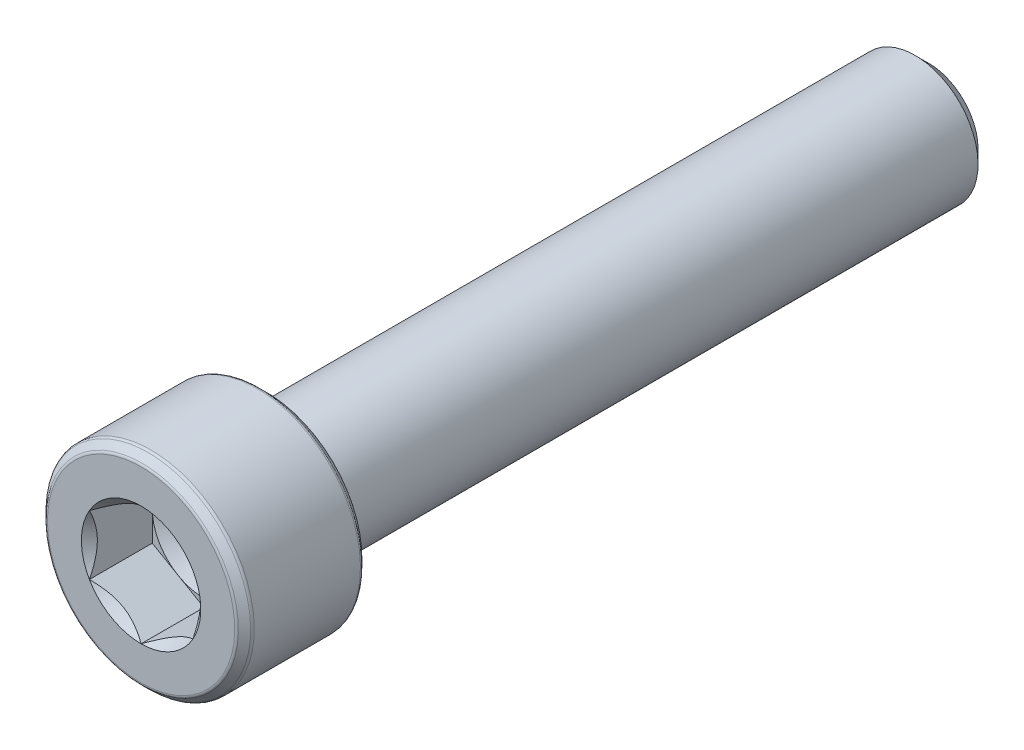
ISO-10303-21;
HEADER;
FILE_DESCRIPTION(('STEP AP214'),'2;1');
FILE_NAME('part.step','',(''),(''),'','','');
FILE_SCHEMA(('AUTOMOTIVE_DESIGN { 1 0 10303 214 1 1 1 1 }'));
ENDSEC;
DATA;
#1=APPLICATION_CONTEXT('core data for automotive mechanical design processes');
#2=APPLICATION_PROTOCOL_DEFINITION('international standard','automotive_design',2000,#1);
#3=PRODUCT_CONTEXT('',#1,'mechanical');
#4=PRODUCT('Part','Part','',(#3));
#5=PRODUCT_RELATED_PRODUCT_CATEGORY('part','',(#4));
#6=PRODUCT_DEFINITION_FORMATION('','',#4);
#7=PRODUCT_DEFINITION_CONTEXT('part definition',#1,'design');
#8=PRODUCT_DEFINITION('design','',#6,#7);
#9=PRODUCT_DEFINITION_SHAPE('','',#8);
#10=(LENGTH_UNIT() NAMED_UNIT(*) SI_UNIT(.MILLI.,.METRE.));
#11=(NAMED_UNIT(*) PLANE_ANGLE_UNIT() SI_UNIT($,.RADIAN.));
#12=(NAMED_UNIT(*) SI_UNIT($,.STERADIAN.) SOLID_ANGLE_UNIT());
#13=UNCERTAINTY_MEASURE_WITH_UNIT(LENGTH_MEASURE(1.E-05),#10,'distance_accuracy_value','');
#14=(GEOMETRIC_REPRESENTATION_CONTEXT(3) GLOBAL_UNCERTAINTY_ASSIGNED_CONTEXT((#13)) GLOBAL_UNIT_ASSIGNED_CONTEXT((#10,
#11,#12)) REPRESENTATION_CONTEXT('',''));
#15=CARTESIAN_POINT('',(0.,0.,0.));
#16=DIRECTION('',(0.,0.,1.));
#17=DIRECTION('',(1.,0.,0.));
#18=AXIS2_PLACEMENT_3D('',#15,#16,#17);
#19=CARTESIAN_POINT('',(0.,1.984375,12.7));
#20=DIRECTION('',(0.,0.,-1.));
#21=DIRECTION('',(0.,1.,0.));
#22=AXIS2_PLACEMENT_3D('',#19,#20,#21);
#23=PLANE('',#22);
#24=DIRECTION('',(-0.866025403784439,0.499999999999999,0.));
#25=VECTOR('',#24,1.);
#26=CARTESIAN_POINT('',(1.98437499999999,1.14567944042317,12.7));
#27=LINE('',#26,#25);
#28=CARTESIAN_POINT('',(1.98437499999999,1.14567944042317,12.7));
#29=VERTEX_POINT('',#28);
#30=CARTESIAN_POINT('',(0.992187499999998,1.71851916063475,12.7));
#31=VERTEX_POINT('',#30);
#32=EDGE_CURVE('E275',#29,#31,#27,.T.);
#33=ORIENTED_EDGE('',*,*,#32,.T.);
#34=CARTESIAN_POINT('',(0.,0.,12.7));
#35=DIRECTION('',(0.,0.,1.));
#36=DIRECTION('',(1.,0.,0.));
#37=AXIS2_PLACEMENT_3D('',#34,#35,#36);
#38=CIRCLE('',#37,1.98437499999999);
#39=CARTESIAN_POINT('',(1.98437499999999,0.,12.7));
#40=VERTEX_POINT('',#39);
#41=EDGE_CURVE('E49',#40,#31,#38,.T.);
#42=ORIENTED_EDGE('',*,*,#41,.F.);
#43=DIRECTION('',(0.,1.,0.));
#44=VECTOR('',#43,1.);
#45=CARTESIAN_POINT('',(1.98437499999999,-1.14567944042315,12.7));
#46=LINE('',#45,#44);
#47=EDGE_CURVE('E56',#40,#29,#46,.T.);
#48=ORIENTED_EDGE('',*,*,#47,.T.);
#49=EDGE_LOOP('',(#33,#42,#48));
#50=FACE_BOUND('',#49,.T.);
#51=ADVANCED_FACE('F33',(#50),#23,.F.);
#52=CARTESIAN_POINT('',(1.98437499999999,-1.14567944042315,12.7));
#53=VERTEX_POINT('',#52);
#54=EDGE_CURVE('E180',#53,#40,#46,.T.);
#55=ORIENTED_EDGE('',*,*,#54,.T.);
#56=CARTESIAN_POINT('',(0.,0.,12.7));
#57=DIRECTION('',(0.,0.,-1.));
#58=DIRECTION('',(0.,1.,0.));
#59=AXIS2_PLACEMENT_3D('',#56,#57,#58);
#60=CIRCLE('',#59,1.98437499999999);
#61=CARTESIAN_POINT('',(0.992187499999997,-1.71851916063473,12.7));
#62=VERTEX_POINT('',#61);
#63=EDGE_CURVE('E11',#40,#62,#60,.T.);
#64=ORIENTED_EDGE('',*,*,#63,.T.);
#65=DIRECTION('',(0.866025403784438,0.500000000000001,0.));
#66=VECTOR('',#65,1.);
#67=CARTESIAN_POINT('',(0.,-2.29135888084632,12.7));
#68=LINE('',#67,#66);
#69=EDGE_CURVE('E176',#62,#53,#68,.T.);
#70=ORIENTED_EDGE('',*,*,#69,.T.);
#71=EDGE_LOOP('',(#55,#64,#70));
#72=FACE_BOUND('',#71,.T.);
#73=ADVANCED_FACE('F119',(#72),#23,.F.);
#74=CARTESIAN_POINT('',(0.,-2.29135888084632,12.7));
#75=VERTEX_POINT('',#74);
#76=EDGE_CURVE('E177',#75,#62,#68,.T.);
#77=ORIENTED_EDGE('',*,*,#76,.T.);
#78=CARTESIAN_POINT('',(-0.992187499999994,-1.71851916063473,12.7));
#79=VERTEX_POINT('',#78);
#80=EDGE_CURVE('E42',#62,#79,#60,.T.);
#81=ORIENTED_EDGE('',*,*,#80,.T.);
#82=DIRECTION('',(0.866025403784439,-0.5,0.));
#83=VECTOR('',#82,1.);
#84=CARTESIAN_POINT('',(-1.984375,-1.14567944042316,12.7));
#85=LINE('',#84,#83);
#86=EDGE_CURVE('E166',#79,#75,#85,.T.);
#87=ORIENTED_EDGE('',*,*,#86,.T.);
#88=EDGE_LOOP('',(#77,#81,#87));
#89=FACE_BOUND('',#88,.T.);
#90=ADVANCED_FACE('F125',(#89),#23,.F.);
#91=CARTESIAN_POINT('',(-1.984375,-1.14567944042316,12.7));
#92=VERTEX_POINT('',#91);
#93=EDGE_CURVE('E169',#92,#79,#85,.T.);
#94=ORIENTED_EDGE('',*,*,#93,.T.);
#95=CARTESIAN_POINT('',(-1.98437499999999,0.,12.7));
#96=VERTEX_POINT('',#95);
#97=EDGE_CURVE('E234',#79,#96,#60,.T.);
#98=ORIENTED_EDGE('',*,*,#97,.T.);
#99=DIRECTION('',(0.,-1.,0.));
#100=VECTOR('',#99,1.);
#101=CARTESIAN_POINT('',(-1.984375,1.14567944042317,12.7));
#102=LINE('',#101,#100);
#103=EDGE_CURVE('E167',#96,#92,#102,.T.);
#104=ORIENTED_EDGE('',*,*,#103,.T.);
#105=EDGE_LOOP('',(#94,#98,#104));
#106=FACE_BOUND('',#105,.T.);
#107=ADVANCED_FACE('F146',(#106),#23,.F.);
#108=CARTESIAN_POINT('',(-1.984375,1.14567944042317,12.7));
#109=VERTEX_POINT('',#108);
#110=EDGE_CURVE('E158',#109,#96,#102,.T.);
#111=ORIENTED_EDGE('',*,*,#110,.T.);
#112=CARTESIAN_POINT('',(-0.992187499999994,1.71851916063474,12.7));
#113=VERTEX_POINT('',#112);
#114=EDGE_CURVE('E159',#96,#113,#60,.T.);
#115=ORIENTED_EDGE('',*,*,#114,.T.);
#116=DIRECTION('',(-0.866025403784439,-0.5,0.));
#117=VECTOR('',#116,1.);
#118=CARTESIAN_POINT('',(0.,2.29135888084633,12.7));
#119=LINE('',#118,#117);
#120=EDGE_CURVE('E161',#113,#109,#119,.T.);
#121=ORIENTED_EDGE('',*,*,#120,.T.);
#122=EDGE_LOOP('',(#111,#115,#121));
#123=FACE_BOUND('',#122,.T.);
#124=ADVANCED_FACE('F133',(#123),#23,.F.);
#125=CARTESIAN_POINT('',(0.,3.59371314735162,15.113));
#126=DIRECTION('',(0.,0.,-1.));
#127=DIRECTION('',(0.,1.,0.));
#128=AXIS2_PLACEMENT_3D('',#125,#126,#127);
#129=PLANE('',#128);
#130=CARTESIAN_POINT('',(0.,0.,15.113));
#131=DIRECTION('',(0.,0.,1.));
#132=DIRECTION('',(1.,0.,0.));
#133=AXIS2_PLACEMENT_3D('',#130,#131,#132);
#134=CIRCLE('',#133,2.29135888084633);
#135=CARTESIAN_POINT('',(0.,2.29135888084633,15.113));
#136=VERTEX_POINT('',#135);
#137=CARTESIAN_POINT('',(-1.984375,1.14567944042317,15.113));
#138=VERTEX_POINT('',#137);
#139=EDGE_CURVE('E254',#136,#138,#134,.T.);
#140=ORIENTED_EDGE('',*,*,#139,.F.);
#141=CARTESIAN_POINT('',(0.,0.,15.113));
#142=DIRECTION('',(0.,0.,1.));
#143=DIRECTION('',(1.,0.,0.));
#144=AXIS2_PLACEMENT_3D('',#141,#142,#143);
#145=CIRCLE('',#144,2.29135888084633);
#146=CARTESIAN_POINT('',(1.98437499999999,1.14567944042318,15.113));
#147=VERTEX_POINT('',#146);
#148=EDGE_CURVE('E336',#147,#136,#145,.T.);
#149=ORIENTED_EDGE('',*,*,#148,.F.);
#150=CARTESIAN_POINT('',(0.,0.,15.113));
#151=DIRECTION('',(0.,0.,1.));
#152=DIRECTION('',(1.,0.,0.));
#153=AXIS2_PLACEMENT_3D('',#150,#151,#152);
#154=CIRCLE('',#153,2.29135888084633);
#155=CARTESIAN_POINT('',(1.98437500000001,-1.14567944042314,15.113));
#156=VERTEX_POINT('',#155);
#157=EDGE_CURVE('E277',#156,#147,#154,.T.);
#158=ORIENTED_EDGE('',*,*,#157,.F.);
#159=CARTESIAN_POINT('',(0.,0.,15.113));
#160=DIRECTION('',(0.,0.,1.));
#161=DIRECTION('',(1.,0.,0.));
#162=AXIS2_PLACEMENT_3D('',#159,#160,#161);
#163=CIRCLE('',#162,2.29135888084633);
#164=CARTESIAN_POINT('',(0.,-2.29135888084633,15.113));
#165=VERTEX_POINT('',#164);
#166=EDGE_CURVE('E312',#165,#156,#163,.T.);
#167=ORIENTED_EDGE('',*,*,#166,.F.);
#168=CARTESIAN_POINT('',(0.,0.,15.113));
#169=DIRECTION('',(0.,0.,1.));
#170=DIRECTION('',(1.,0.,0.));
#171=AXIS2_PLACEMENT_3D('',#168,#169,#170);
#172=CIRCLE('',#171,2.29135888084633);
#173=CARTESIAN_POINT('',(-1.984375,-1.14567944042317,15.113));
#174=VERTEX_POINT('',#173);
#175=EDGE_CURVE('E253',#174,#165,#172,.T.);
#176=ORIENTED_EDGE('',*,*,#175,.F.);
#177=CARTESIAN_POINT('',(0.,0.,15.113));
#178=DIRECTION('',(0.,0.,1.));
#179=DIRECTION('',(1.,0.,0.));
#180=AXIS2_PLACEMENT_3D('',#177,#178,#179);
#181=CIRCLE('',#180,2.29135888084633);
#182=EDGE_CURVE('E328',#138,#174,#181,.T.);
#183=ORIENTED_EDGE('',*,*,#182,.F.);
#184=EDGE_LOOP('',(#140,#149,#158,#167,#176,#183));
#185=FACE_BOUND('',#184,.T.);
#186=CARTESIAN_POINT('',(0.,0.,15.113));
#187=DIRECTION('',(0.,0.,1.));
#188=DIRECTION('',(0.,-1.,0.));
#189=AXIS2_PLACEMENT_3D('',#186,#187,#188);
#190=CIRCLE('',#189,3.59371314735161);
#191=CARTESIAN_POINT('',(0.,-3.59371314735161,15.113));
#192=VERTEX_POINT('',#191);
#193=EDGE_CURVE('E229',#192,#192,#190,.T.);
#194=ORIENTED_EDGE('',*,*,#193,.T.);
#195=EDGE_LOOP('',(#194));
#196=FACE_BOUND('',#195,.T.);
#197=ADVANCED_FACE('F35',(#185,#196),#129,.F.);
#198=CARTESIAN_POINT('',(0.,0.,14.97409375));
#199=DIRECTION('',(0.,0.,1.));
#200=DIRECTION('',(0.,-1.,0.));
#201=AXIS2_PLACEMENT_3D('',#198,#199,#200);
#202=TOROIDAL_SURFACE('',#201,3.59371314735161,0.138906249999999);
#203=ORIENTED_EDGE('',*,*,#193,.F.);
#204=EDGE_LOOP('',(#203));
#205=FACE_BOUND('',#204,.T.);
#206=CARTESIAN_POINT('',(0.,0.,15.0723153013242));
#207=DIRECTION('',(0.,0.,1.));
#208=DIRECTION('',(0.,-1.,0.));
#209=AXIS2_PLACEMENT_3D('',#206,#207,#208);
#210=CIRCLE('',#209,3.69193469867581);
#211=CARTESIAN_POINT('',(0.,-3.6919346986758,15.0723153013242));
#212=VERTEX_POINT('',#211);
#213=EDGE_CURVE('E227',#212,#212,#210,.T.);
#214=ORIENTED_EDGE('',*,*,#213,.T.);
#215=EDGE_LOOP('',(#214));
#216=FACE_BOUND('',#215,.T.);
#217=ADVANCED_FACE('F152',(#205,#216),#202,.T.);
#218=CARTESIAN_POINT('',(0.,0.,14.8361846986758));
#219=DIRECTION('',(0.,0.,-1.));
#220=DIRECTION('',(0.,1.,0.));
#221=AXIS2_PLACEMENT_3D('',#218,#219,#220);
#222=CONICAL_SURFACE('',#221,3.92806530132419,0.785398163397457);
#223=ORIENTED_EDGE('',*,*,#213,.F.);
#224=EDGE_LOOP('',(#223));
#225=FACE_BOUND('',#224,.T.);
#226=CARTESIAN_POINT('',(0.,0.,14.8361846986758));
#227=DIRECTION('',(0.,0.,1.));
#228=DIRECTION('',(0.,-1.,0.));
#229=AXIS2_PLACEMENT_3D('',#226,#227,#228);
#230=CIRCLE('',#229,3.92806530132419);
#231=CARTESIAN_POINT('',(0.,-3.92806530132419,14.8361846986758));
#232=VERTEX_POINT('',#231);
#233=EDGE_CURVE('E224',#232,#232,#230,.T.);
#234=ORIENTED_EDGE('',*,*,#233,.T.);
#235=EDGE_LOOP('',(#234));
#236=FACE_BOUND('',#235,.T.);
#237=ADVANCED_FACE('F574',(#225,#236),#222,.T.);
#238=CARTESIAN_POINT('',(0.,0.,14.7379631473516));
#239=DIRECTION('',(0.,0.,1.));
#240=DIRECTION('',(0.,-1.,0.));
#241=AXIS2_PLACEMENT_3D('',#238,#239,#240);
#242=TOROIDAL_SURFACE('',#241,3.82984375,0.138906249999999);
#243=ORIENTED_EDGE('',*,*,#233,.F.);
#244=EDGE_LOOP('',(#243));
#245=FACE_BOUND('',#244,.T.);
#246=CARTESIAN_POINT('',(0.,0.,14.7379631473516));
#247=DIRECTION('',(0.,0.,1.));
#248=DIRECTION('',(0.,-1.,0.));
#249=AXIS2_PLACEMENT_3D('',#246,#247,#248);
#250=CIRCLE('',#249,3.96875);
#251=CARTESIAN_POINT('',(0.,-3.96875,14.7379631473516));
#252=VERTEX_POINT('',#251);
#253=EDGE_CURVE('E221',#252,#252,#250,.T.);
#254=ORIENTED_EDGE('',*,*,#253,.T.);
#255=EDGE_LOOP('',(#254));
#256=FACE_BOUND('',#255,.T.);
#257=ADVANCED_FACE('F564',(#245,#256),#242,.T.);
#258=CARTESIAN_POINT('',(0.,0.,15.113));
#259=DIRECTION('',(0.,0.,1.));
#260=DIRECTION('',(0.,-1.,0.));
#261=AXIS2_PLACEMENT_3D('',#258,#259,#260);
#262=CYLINDRICAL_SURFACE('',#261,3.96875);
#263=ORIENTED_EDGE('',*,*,#253,.F.);
#264=EDGE_LOOP('',(#263));
#265=FACE_BOUND('',#264,.T.);
#266=CARTESIAN_POINT('',(0.,0.,10.6620368526484));
#267=DIRECTION('',(0.,0.,1.));
#268=DIRECTION('',(0.,-1.,0.));
#269=AXIS2_PLACEMENT_3D('',#266,#267,#268);
#270=CIRCLE('',#269,3.96875);
#271=CARTESIAN_POINT('',(0.,-3.96875,10.6620368526484));
#272=VERTEX_POINT('',#271);
#273=EDGE_CURVE('E218',#272,#272,#270,.T.);
#274=ORIENTED_EDGE('',*,*,#273,.T.);
#275=EDGE_LOOP('',(#274));
#276=FACE_BOUND('',#275,.T.);
#277=ADVANCED_FACE('F554',(#265,#276),#262,.T.);
#278=CARTESIAN_POINT('',(0.,0.,10.6620368526484));
#279=DIRECTION('',(0.,0.,1.));
#280=DIRECTION('',(0.,-1.,0.));
#281=AXIS2_PLACEMENT_3D('',#278,#279,#280);
#282=TOROIDAL_SURFACE('',#281,3.82984375,0.138906250000001);
#283=ORIENTED_EDGE('',*,*,#273,.F.);
#284=EDGE_LOOP('',(#283));
#285=FACE_BOUND('',#284,.T.);
#286=CARTESIAN_POINT('',(0.,0.,10.5638153013242));
#287=DIRECTION('',(0.,0.,1.));
#288=DIRECTION('',(0.,-1.,0.));
#289=AXIS2_PLACEMENT_3D('',#286,#287,#288);
#290=CIRCLE('',#289,3.9280653013242);
#291=CARTESIAN_POINT('',(0.,-3.92806530132419,10.5638153013242));
#292=VERTEX_POINT('',#291);
#293=EDGE_CURVE('E215',#292,#292,#290,.T.);
#294=ORIENTED_EDGE('',*,*,#293,.T.);
#295=EDGE_LOOP('',(#294));
#296=FACE_BOUND('',#295,.T.);
#297=ADVANCED_FACE('F544',(#285,#296),#282,.T.);
#298=CARTESIAN_POINT('',(0.,0.,10.3276846986758));
#299=DIRECTION('',(0.,0.,1.));
#300=DIRECTION('',(0.,-1.,0.));
#301=AXIS2_PLACEMENT_3D('',#298,#299,#300);
#302=CONICAL_SURFACE('',#301,3.69193469867581,0.785398163397449);
#303=ORIENTED_EDGE('',*,*,#293,.F.);
#304=EDGE_LOOP('',(#303));
#305=FACE_BOUND('',#304,.T.);
#306=CARTESIAN_POINT('',(0.,0.,10.3276846986758));
#307=DIRECTION('',(0.,0.,1.));
#308=DIRECTION('',(0.,-1.,0.));
#309=AXIS2_PLACEMENT_3D('',#306,#307,#308);
#310=CIRCLE('',#309,3.69193469867581);
#311=CARTESIAN_POINT('',(0.,-3.69193469867581,10.3276846986758));
#312=VERTEX_POINT('',#311);
#313=EDGE_CURVE('E212',#312,#312,#310,.T.);
#314=ORIENTED_EDGE('',*,*,#313,.T.);
#315=EDGE_LOOP('',(#314));
#316=FACE_BOUND('',#315,.T.);
#317=ADVANCED_FACE('F534',(#305,#316),#302,.T.);
#318=CARTESIAN_POINT('',(0.,0.,10.42590625));
#319=DIRECTION('',(0.,0.,1.));
#320=DIRECTION('',(0.,-1.,0.));
#321=AXIS2_PLACEMENT_3D('',#318,#319,#320);
#322=TOROIDAL_SURFACE('',#321,3.59371314735162,0.138906249999999);
#323=ORIENTED_EDGE('',*,*,#313,.F.);
#324=EDGE_LOOP('',(#323));
#325=FACE_BOUND('',#324,.T.);
#326=CARTESIAN_POINT('',(0.,0.,10.287));
#327=DIRECTION('',(0.,0.,1.));
#328=DIRECTION('',(0.,-1.,0.));
#329=AXIS2_PLACEMENT_3D('',#326,#327,#328);
#330=CIRCLE('',#329,3.59371314735162);
#331=CARTESIAN_POINT('',(0.,-3.59371314735162,10.287));
#332=VERTEX_POINT('',#331);
#333=EDGE_CURVE('E209',#332,#332,#330,.T.);
#334=ORIENTED_EDGE('',*,*,#333,.T.);
#335=EDGE_LOOP('',(#334));
#336=FACE_BOUND('',#335,.T.);
#337=ADVANCED_FACE('F524',(#325,#336),#322,.T.);
#338=CARTESIAN_POINT('',(0.,2.41299999999999,10.287));
#339=DIRECTION('',(0.,0.,1.));
#340=DIRECTION('',(0.,-1.,0.));
#341=AXIS2_PLACEMENT_3D('',#338,#339,#340);
#342=PLANE('',#341);
#343=ORIENTED_EDGE('',*,*,#333,.F.);
#344=EDGE_LOOP('',(#343));
#345=FACE_BOUND('',#344,.T.);
#346=CARTESIAN_POINT('',(0.,0.,10.287));
#347=DIRECTION('',(0.,0.,1.));
#348=DIRECTION('',(0.,-1.,0.));
#349=AXIS2_PLACEMENT_3D('',#346,#347,#348);
#350=CIRCLE('',#349,2.41299999999999);
#351=CARTESIAN_POINT('',(0.,-2.41299999999999,10.287));
#352=VERTEX_POINT('',#351);
#353=EDGE_CURVE('E206',#352,#352,#350,.T.);
#354=ORIENTED_EDGE('',*,*,#353,.T.);
#355=EDGE_LOOP('',(#354));
#356=FACE_BOUND('',#355,.T.);
#357=ADVANCED_FACE('F514',(#345,#356),#342,.F.);
#358=CARTESIAN_POINT('',(0.,0.,15.113));
#359=DIRECTION('',(0.,0.,1.));
#360=DIRECTION('',(0.,-1.,0.));
#361=AXIS2_PLACEMENT_3D('',#358,#359,#360);
#362=CYLINDRICAL_SURFACE('',#361,2.41299999999999);
#363=ORIENTED_EDGE('',*,*,#353,.F.);
#364=EDGE_LOOP('',(#363));
#365=FACE_BOUND('',#364,.T.);
#366=CARTESIAN_POINT('',(0.,0.,-14.5974442518096));
#367=DIRECTION('',(0.,0.,1.));
#368=DIRECTION('',(0.,-1.,0.));
#369=AXIS2_PLACEMENT_3D('',#366,#367,#368);
#370=CIRCLE('',#369,2.41299999999999);
#371=CARTESIAN_POINT('',(0.,-2.41299999999999,-14.5974442518096));
#372=VERTEX_POINT('',#371);
#373=EDGE_CURVE('E203',#372,#372,#370,.T.);
#374=ORIENTED_EDGE('',*,*,#373,.T.);
#375=EDGE_LOOP('',(#374));
#376=FACE_BOUND('',#375,.T.);
#377=ADVANCED_FACE('F504',(#365,#376),#362,.T.);
#378=CARTESIAN_POINT('',(0.,0.,-15.113));
#379=DIRECTION('',(0.,0.,1.));
#380=DIRECTION('',(0.,-1.,0.));
#381=AXIS2_PLACEMENT_3D('',#378,#379,#380);
#382=CONICAL_SURFACE('',#381,1.89744425180956,0.785398163397449);
#383=ORIENTED_EDGE('',*,*,#373,.F.);
#384=EDGE_LOOP('',(#383));
#385=FACE_BOUND('',#384,.T.);
#386=CARTESIAN_POINT('',(0.,0.,-15.113));
#387=DIRECTION('',(0.,0.,1.));
#388=DIRECTION('',(0.,-1.,0.));
#389=AXIS2_PLACEMENT_3D('',#386,#387,#388);
#390=CIRCLE('',#389,1.89744425180956);
#391=CARTESIAN_POINT('',(0.,-1.89744425180956,-15.113));
#392=VERTEX_POINT('',#391);
#393=EDGE_CURVE('E187',#392,#392,#390,.T.);
#394=ORIENTED_EDGE('',*,*,#393,.T.);
#395=EDGE_LOOP('',(#394));
#396=FACE_BOUND('',#395,.T.);
#397=ADVANCED_FACE('F495',(#385,#396),#382,.T.);
#398=CARTESIAN_POINT('',(0.,0.,-15.113));
#399=DIRECTION('',(0.,0.,1.));
#400=DIRECTION('',(0.,-1.,0.));
#401=AXIS2_PLACEMENT_3D('',#398,#399,#400);
#402=PLANE('',#401);
#403=ORIENTED_EDGE('',*,*,#393,.F.);
#404=EDGE_LOOP('',(#403));
#405=FACE_BOUND('',#404,.T.);
#406=ADVANCED_FACE('F407',(#405),#402,.F.);
#407=CARTESIAN_POINT('',(1.98437499999999,1.14567944042317,12.7));
#408=DIRECTION('',(0.499999999999999,0.866025403784439,0.));
#409=DIRECTION('',(-0.866025403784439,0.499999999999999,0.));
#410=AXIS2_PLACEMENT_3D('',#407,#408,#409);
#411=PLANE('',#410);
#412=DIRECTION('',(0.,0.,1.));
#413=VECTOR('',#412,1.);
#414=CARTESIAN_POINT('',(1.98437499999999,1.14567944042317,12.7));
#415=LINE('',#414,#413);
#416=EDGE_CURVE('E184',#29,#147,#415,.T.);
#417=ORIENTED_EDGE('',*,*,#416,.T.);
#418=CARTESIAN_POINT('',(-0.0002,2.29147435090017,15.1131154787818));
#419=CARTESIAN_POINT('',(0.0680159951668025,2.25208982772758,15.0737628522639));
#420=CARTESIAN_POINT('',(0.137372685106966,2.21204672412052,15.0367213104462));
#421=CARTESIAN_POINT('',(0.278798800452187,2.13039431835551,14.9688988584233));
#422=CARTESIAN_POINT('',(0.350881678736781,2.08877724917394,14.9381556890918));
#423=CARTESIAN_POINT('',(0.496233397266002,2.00485839535392,14.8854918888112));
#424=CARTESIAN_POINT('',(0.569465212486937,1.96257798712287,14.86343887588));
#425=CARTESIAN_POINT('',(0.717541182594704,1.87708628592063,14.8294614929439));
#426=CARTESIAN_POINT('',(0.792380812753423,1.83387760530245,14.8175117560917));
#427=CARTESIAN_POINT('',(0.921360414543814,1.75941119748879,14.8067300990819));
#428=CARTESIAN_POINT('',(0.97533371577244,1.72824969749539,14.8051338990591));
#429=CARTESIAN_POINT('',(1.0831921185198,1.66597761963484,14.8078218388653));
#430=CARTESIAN_POINT('',(1.13707718248552,1.63486706344893,14.8121080403405));
#431=CARTESIAN_POINT('',(1.2443385382486,1.57293969082547,14.8263168730135));
#432=CARTESIAN_POINT('',(1.29771419276014,1.54212324232507,14.8362458104523));
#433=CARTESIAN_POINT('',(1.4035425174089,1.48102323060122,14.8611950842745));
#434=CARTESIAN_POINT('',(1.4559952579711,1.4507396267179,14.8762150303895));
#435=CARTESIAN_POINT('',(1.59035733896365,1.37316564308797,14.9208078516357));
#436=CARTESIAN_POINT('',(1.67143335715832,1.32635638215846,14.9537429959383));
#437=CARTESIAN_POINT('',(1.79064830672983,1.25752759893192,15.0093424412022));
#438=CARTESIAN_POINT('',(1.82993492438599,1.23484545965258,15.0288775920519));
#439=CARTESIAN_POINT('',(1.90778036186804,1.18990137536713,15.0697287381194));
#440=CARTESIAN_POINT('',(1.94633961110169,1.16763918244234,15.0910436395683));
#441=CARTESIAN_POINT('',(1.98457499999999,1.14556397036934,15.1131154787818));
#442=B_SPLINE_CURVE_WITH_KNOTS('',3,(#418,#419,#420,#421,#422,#423,#424,#425,#426,#427,#428,
#429,#430,#431,#432,#433,#434,#435,#436,#437,#438,#439,#440,#441),.UNSPECIFIED.,.F.,.F.,(4,2,2,
2,2,2,2,2,2,2,2,4),(0.,0.264339630306625,0.530219665093691,0.791876416371457,1.05287424418109,
1.239639843932,1.42647091743852,1.61351120244034,1.8005371524754,2.09764209964315,
2.24579179873712,2.39385111134156),.UNSPECIFIED.);
#443=EDGE_CURVE('E273',#136,#147,#442,.T.);
#444=ORIENTED_EDGE('',*,*,#443,.F.);
#445=DIRECTION('',(0.,0.,1.));
#446=VECTOR('',#445,1.);
#447=CARTESIAN_POINT('',(0.,2.29135888084633,12.7));
#448=LINE('',#447,#446);
#449=CARTESIAN_POINT('',(0.,2.29135888084633,12.7));
#450=VERTEX_POINT('',#449);
#451=EDGE_CURVE('E183',#450,#136,#448,.T.);
#452=ORIENTED_EDGE('',*,*,#451,.F.);
#453=EDGE_CURVE('E276',#31,#450,#27,.T.);
#454=ORIENTED_EDGE('',*,*,#453,.F.);
#455=ORIENTED_EDGE('',*,*,#32,.F.);
#456=EDGE_LOOP('',(#417,#444,#452,#454,#455));
#457=FACE_BOUND('',#456,.T.);
#458=ADVANCED_FACE('F271',(#457),#411,.F.);
#459=CARTESIAN_POINT('',(1.98437499999999,-1.14567944042315,12.7));
#460=DIRECTION('',(1.,0.,0.));
#461=DIRECTION('',(0.,1.,0.));
#462=AXIS2_PLACEMENT_3D('',#459,#460,#461);
#463=PLANE('',#462);
#464=DIRECTION('',(0.,0.,1.));
#465=VECTOR('',#464,1.);
#466=CARTESIAN_POINT('',(1.98437499999999,-1.14567944042315,12.7));
#467=LINE('',#466,#465);
#468=EDGE_CURVE('E188',#53,#156,#467,.T.);
#469=ORIENTED_EDGE('',*,*,#468,.T.);
#470=CARTESIAN_POINT('',(1.98437499999999,-2.28495242157821,15.8479840788166));
#471=CARTESIAN_POINT('',(1.98437499999999,-2.229316354554,15.8059866855507));
#472=CARTESIAN_POINT('',(1.98437499999999,-2.17336876548388,15.7643960540763));
#473=CARTESIAN_POINT('',(1.98437499999999,-2.0607277025817,15.6822084614715));
#474=CARTESIAN_POINT('',(1.98437499999999,-2.00403404503433,15.641611752405));
#475=CARTESIAN_POINT('',(1.98437499999999,-1.88936329173487,15.5613035031747));
#476=CARTESIAN_POINT('',(1.98437499999999,-1.83137965519347,15.5216012588133));
#477=CARTESIAN_POINT('',(1.98437499999999,-1.71442802137839,15.4436851734013));
#478=CARTESIAN_POINT('',(1.98437499999999,-1.65546009407226,15.4054712271944));
#479=CARTESIAN_POINT('',(1.98437499999999,-1.47005472306034,15.2892528340136));
#480=CARTESIAN_POINT('',(1.98437499999999,-1.34163909427883,15.2143478868724));
#481=CARTESIAN_POINT('',(1.98437499999999,-1.07840384705479,15.0773302154397));
#482=CARTESIAN_POINT('',(1.98437499999999,-0.943607781407418,15.0151743664824));
#483=CARTESIAN_POINT('',(1.98437499999999,-0.741275100444876,14.9391325786886));
#484=CARTESIAN_POINT('',(1.98437499999999,-0.676735408881089,14.917308061326));
#485=CARTESIAN_POINT('',(1.98437499999999,-0.546098118112756,14.8788404635378));
#486=CARTESIAN_POINT('',(1.98437499999999,-0.480000411919951,14.8621977400655));
#487=CARTESIAN_POINT('',(1.98437499999999,-0.347746170028528,14.8352353808697));
#488=CARTESIAN_POINT('',(1.98437499999999,-0.281612071479119,14.8248074097359));
#489=CARTESIAN_POINT('',(1.98437499999999,-0.148636620052347,14.8104781473766));
#490=CARTESIAN_POINT('',(1.98437499999999,-0.0817953907393207,14.8065757342274));
#491=CARTESIAN_POINT('',(1.98437499999999,0.0495156750890666,14.8055870513327));
#492=CARTESIAN_POINT('',(1.98437499999999,0.113983775102993,14.808259178875));
#493=CARTESIAN_POINT('',(1.98437499999999,0.242367515846178,14.8197392104975));
#494=CARTESIAN_POINT('',(1.98437499999999,0.30628310229592,14.8285477106392));
#495=CARTESIAN_POINT('',(1.98437499999999,0.434181040262184,14.8519690213329));
#496=CARTESIAN_POINT('',(1.98437499999999,0.498145026858309,14.8666806062321));
#497=CARTESIAN_POINT('',(1.98437499999999,0.624675616953006,14.9011261814121));
#498=CARTESIAN_POINT('',(1.98437499999999,0.687242336899687,14.9208597514492));
#499=CARTESIAN_POINT('',(1.98437499999999,0.884225483826085,14.9904122372307));
#500=CARTESIAN_POINT('',(1.98437499999999,1.01583674256468,15.0481524112565));
#501=CARTESIAN_POINT('',(1.98437499999999,1.27288659242651,15.1765303365888));
#502=CARTESIAN_POINT('',(1.98437499999999,1.39830088270479,15.2472144249194));
#503=CARTESIAN_POINT('',(1.98437499999999,1.57956687990221,15.3575166638132));
#504=CARTESIAN_POINT('',(1.98437499999999,1.63738271299423,15.3939698294753));
#505=CARTESIAN_POINT('',(1.98437499999999,1.75202215386201,15.4684159632917));
#506=CARTESIAN_POINT('',(1.98437499999999,1.80884568601361,15.506409048078));
#507=CARTESIAN_POINT('',(1.98437499999999,1.92116923084255,15.5833388088931));
#508=CARTESIAN_POINT('',(1.98437499999999,1.97667624512252,15.6222653130388));
#509=CARTESIAN_POINT('',(1.98437499999999,2.08693170717165,15.7011477461214));
#510=CARTESIAN_POINT('',(1.98437499999999,2.14168035934792,15.741103389024));
#511=CARTESIAN_POINT('',(1.98437499999999,2.19611149046621,15.7814806112854));
#512=B_SPLINE_CURVE_WITH_KNOTS('',3,(#470,#471,#472,#473,#474,#475,#476,#477,#478,#479,#480,
#481,#482,#483,#484,#485,#486,#487,#488,#489,#490,#491,#492,#493,#494,#495,#496,#497,#498,#499,
#500,#501,#502,#503,#504,#505,#506,#507,#508,#509,#510,#511),.UNSPECIFIED.,.F.,.F.,(4,2,2,2,2,2,
2,2,2,2,2,2,2,2,2,2,2,2,2,2,4),(0.,0.209126070008321,0.418304637356566,0.629103979977988,
0.839888401371179,1.28549951116126,1.7295775076835,1.9337938974997,2.13802435186697,
2.33858179514332,2.53910475350638,2.73236963400793,2.92565329006885,3.12231577097486,
3.31896180041343,3.7488629524517,4.1803342812536,4.38536017180288,4.5904016199638,
4.79377749165105,4.99709743524129),.UNSPECIFIED.);
#513=EDGE_CURVE('E268',#147,#156,#512,.F.);
#514=ORIENTED_EDGE('',*,*,#513,.F.);
#515=ORIENTED_EDGE('',*,*,#416,.F.);
#516=ORIENTED_EDGE('',*,*,#47,.F.);
#517=ORIENTED_EDGE('',*,*,#54,.F.);
#518=EDGE_LOOP('',(#469,#514,#515,#516,#517));
#519=FACE_BOUND('',#518,.T.);
#520=ADVANCED_FACE('F265',(#519),#463,.F.);
#521=CARTESIAN_POINT('',(0.,-2.29135888084632,12.7));
#522=DIRECTION('',(0.500000000000001,-0.866025403784438,0.));
#523=DIRECTION('',(0.866025403784438,0.500000000000001,0.));
#524=AXIS2_PLACEMENT_3D('',#521,#522,#523);
#525=PLANE('',#524);
#526=DIRECTION('',(0.,0.,1.));
#527=VECTOR('',#526,1.);
#528=CARTESIAN_POINT('',(0.,-2.29135888084632,12.7));
#529=LINE('',#528,#527);
#530=EDGE_CURVE('E191',#75,#165,#529,.T.);
#531=ORIENTED_EDGE('',*,*,#530,.T.);
#532=CARTESIAN_POINT('',(1.98457499999999,-1.14556397036932,15.1131154787818));
#533=CARTESIAN_POINT('',(1.91635900483319,-1.18494849354191,15.0737628522639));
#534=CARTESIAN_POINT('',(1.84700231489303,-1.22499159714896,15.0367213104462));
#535=CARTESIAN_POINT('',(1.70557619954781,-1.30664400291397,14.9688988584233));
#536=CARTESIAN_POINT('',(1.63349332126321,-1.34826107209554,14.9381556890917));
#537=CARTESIAN_POINT('',(1.48814160273399,-1.43217992591556,14.8854918888112));
#538=CARTESIAN_POINT('',(1.41490978751306,-1.47446033414661,14.86343887588));
#539=CARTESIAN_POINT('',(1.26683381740529,-1.55995203534885,14.8294614929439));
#540=CARTESIAN_POINT('',(1.19199418724657,-1.60316071596704,14.8175117560917));
#541=CARTESIAN_POINT('',(1.06301458545618,-1.67762712378069,14.8067300990819));
#542=CARTESIAN_POINT('',(1.00904128422756,-1.70878862377409,14.8051338990591));
#543=CARTESIAN_POINT('',(0.901182881480198,-1.77106070163464,14.8078218388653));
#544=CARTESIAN_POINT('',(0.847297817514475,-1.80217125782055,14.8121080403404));
#545=CARTESIAN_POINT('',(0.740036461751395,-1.86409863044401,14.8263168730135));
#546=CARTESIAN_POINT('',(0.68666080723986,-1.89491507894442,14.8362458104523));
#547=CARTESIAN_POINT('',(0.580832482591104,-1.95601509066826,14.8611950842745));
#548=CARTESIAN_POINT('',(0.5283797420289,-1.98629869455158,14.8762150303895));
#549=CARTESIAN_POINT('',(0.394017661036352,-2.06387267818151,14.9208078516357));
#550=CARTESIAN_POINT('',(0.312941642841675,-2.11068193911103,14.9537429959383));
#551=CARTESIAN_POINT('',(0.19372669327016,-2.17951072233757,15.0093424412022));
#552=CARTESIAN_POINT('',(0.154440075613998,-2.20219286161691,15.0288775920518));
#553=CARTESIAN_POINT('',(0.0765946381319462,-2.24713694590235,15.0697287381194));
#554=CARTESIAN_POINT('',(0.0380353888983003,-2.26939913882715,15.0910436395683));
#555=CARTESIAN_POINT('',(-0.000200000000001587,-2.29147435090015,15.1131154787818));
#556=B_SPLINE_CURVE_WITH_KNOTS('',3,(#532,#533,#534,#535,#536,#537,#538,#539,#540,#541,#542,
#543,#544,#545,#546,#547,#548,#549,#550,#551,#552,#553,#554,#555),.UNSPECIFIED.,.F.,.F.,(4,2,2,
2,2,2,2,2,2,2,2,4),(0.,0.264339630306625,0.530219665093691,0.791876416371456,1.05287424418109,
1.23963984393199,1.42647091743851,1.61351120244034,1.80053715247539,2.09764209964316,
2.24579179873713,2.39385111134157),.UNSPECIFIED.);
#557=EDGE_CURVE('E260',#156,#165,#556,.T.);
#558=ORIENTED_EDGE('',*,*,#557,.F.);
#559=ORIENTED_EDGE('',*,*,#468,.F.);
#560=ORIENTED_EDGE('',*,*,#69,.F.);
#561=ORIENTED_EDGE('',*,*,#76,.F.);
#562=EDGE_LOOP('',(#531,#558,#559,#560,#561));
#563=FACE_BOUND('',#562,.T.);
#564=ADVANCED_FACE('F258',(#563),#525,.F.);
#565=CARTESIAN_POINT('',(-1.984375,-1.14567944042316,12.7));
#566=DIRECTION('',(-0.5,-0.866025403784439,0.));
#567=DIRECTION('',(0.866025403784439,-0.5,0.));
#568=AXIS2_PLACEMENT_3D('',#565,#566,#567);
#569=PLANE('',#568);
#570=DIRECTION('',(0.,0.,1.));
#571=VECTOR('',#570,1.);
#572=CARTESIAN_POINT('',(-1.984375,-1.14567944042316,12.7));
#573=LINE('',#572,#571);
#574=EDGE_CURVE('E194',#92,#174,#573,.T.);
#575=ORIENTED_EDGE('',*,*,#574,.T.);
#576=CARTESIAN_POINT('',(0.00019999999999857,-2.29147435090015,15.1131154787818));
#577=CARTESIAN_POINT('',(-0.0680159951668038,-2.25208982772756,15.0737628522639));
#578=CARTESIAN_POINT('',(-0.137372685106967,-2.21204672412051,15.0367213104462));
#579=CARTESIAN_POINT('',(-0.278798800452187,-2.1303943183555,14.9688988584233));
#580=CARTESIAN_POINT('',(-0.350881678736782,-2.08877724917393,14.9381556890917));
#581=CARTESIAN_POINT('',(-0.496233397266002,-2.00485839535391,14.8854918888112));
#582=CARTESIAN_POINT('',(-0.569465212486936,-1.96257798712286,14.86343887588));
#583=CARTESIAN_POINT('',(-0.717541182594703,-1.87708628592062,14.8294614929439));
#584=CARTESIAN_POINT('',(-0.79238081275342,-1.83387760530244,14.8175117560917));
#585=CARTESIAN_POINT('',(-0.921360414543811,-1.75941119748878,14.8067300990819));
#586=CARTESIAN_POINT('',(-0.975333715772437,-1.72824969749538,14.8051338990591));
#587=CARTESIAN_POINT('',(-1.0831921185198,-1.66597761963483,14.8078218388653));
#588=CARTESIAN_POINT('',(-1.13707718248552,-1.63486706344892,14.8121080403404));
#589=CARTESIAN_POINT('',(-1.2443385382486,-1.57293969082546,14.8263168730135));
#590=CARTESIAN_POINT('',(-1.29771419276013,-1.54212324232506,14.8362458104523));
#591=CARTESIAN_POINT('',(-1.40354251740889,-1.48102323060121,14.8611950842745));
#592=CARTESIAN_POINT('',(-1.45599525797109,-1.45073962671789,14.8762150303895));
#593=CARTESIAN_POINT('',(-1.59035733896364,-1.37316564308796,14.9208078516357));
#594=CARTESIAN_POINT('',(-1.67143335715832,-1.32635638215844,14.9537429959383));
#595=CARTESIAN_POINT('',(-1.79064830672984,-1.2575275989319,15.0093424412022));
#596=CARTESIAN_POINT('',(-1.829934924386,-1.23484545965256,15.0288775920519));
#597=CARTESIAN_POINT('',(-1.90778036186805,-1.18990137536712,15.0697287381194));
#598=CARTESIAN_POINT('',(-1.9463396111017,-1.16763918244232,15.0910436395683));
#599=CARTESIAN_POINT('',(-1.984575,-1.14556397036932,15.1131154787818));
#600=B_SPLINE_CURVE_WITH_KNOTS('',3,(#576,#577,#578,#579,#580,#581,#582,#583,#584,#585,#586,
#587,#588,#589,#590,#591,#592,#593,#594,#595,#596,#597,#598,#599),.UNSPECIFIED.,.F.,.F.,(4,2,2,
2,2,2,2,2,2,2,2,4),(0.,0.264339630306625,0.53021966509369,0.791876416371454,1.05287424418108,
1.23963984393199,1.42647091743851,1.61351120244034,1.80053715247539,2.09764209964315,
2.24579179873713,2.39385111134157),.UNSPECIFIED.);
#601=EDGE_CURVE('E249',#165,#174,#600,.T.);
#602=ORIENTED_EDGE('',*,*,#601,.F.);
#603=ORIENTED_EDGE('',*,*,#530,.F.);
#604=ORIENTED_EDGE('',*,*,#86,.F.);
#605=ORIENTED_EDGE('',*,*,#93,.F.);
#606=EDGE_LOOP('',(#575,#602,#603,#604,#605));
#607=FACE_BOUND('',#606,.T.);
#608=ADVANCED_FACE('F243',(#607),#569,.F.);
#609=CARTESIAN_POINT('',(-1.984375,1.14567944042317,12.7));
#610=DIRECTION('',(-1.,0.,0.));
#611=DIRECTION('',(0.,0.,1.));
#612=AXIS2_PLACEMENT_3D('',#609,#610,#611);
#613=PLANE('',#612);
#614=DIRECTION('',(0.,0.,1.));
#615=VECTOR('',#614,1.);
#616=CARTESIAN_POINT('',(-1.984375,1.14567944042317,12.7));
#617=LINE('',#616,#615);
#618=EDGE_CURVE('E197',#109,#138,#617,.T.);
#619=ORIENTED_EDGE('',*,*,#618,.T.);
#620=CARTESIAN_POINT('',(-1.984375,-2.28495242157821,15.8479840788166));
#621=CARTESIAN_POINT('',(-1.984375,-2.229316354554,15.8059866855507));
#622=CARTESIAN_POINT('',(-1.984375,-2.17336876548388,15.7643960540763));
#623=CARTESIAN_POINT('',(-1.984375,-2.0607277025817,15.6822084614715));
#624=CARTESIAN_POINT('',(-1.984375,-2.00403404503433,15.641611752405));
#625=CARTESIAN_POINT('',(-1.984375,-1.88936329173487,15.5613035031747));
#626=CARTESIAN_POINT('',(-1.984375,-1.83137965519347,15.5216012588133));
#627=CARTESIAN_POINT('',(-1.984375,-1.71442802137839,15.4436851734013));
#628=CARTESIAN_POINT('',(-1.984375,-1.65546009407226,15.4054712271944));
#629=CARTESIAN_POINT('',(-1.984375,-1.47005472306034,15.2892528340136));
#630=CARTESIAN_POINT('',(-1.984375,-1.34163909427882,15.2143478868724));
#631=CARTESIAN_POINT('',(-1.984375,-1.07840384705479,15.0773302154397));
#632=CARTESIAN_POINT('',(-1.984375,-0.943607781407418,15.0151743664824));
#633=CARTESIAN_POINT('',(-1.984375,-0.741275100444876,14.9391325786886));
#634=CARTESIAN_POINT('',(-1.984375,-0.676735408881089,14.917308061326));
#635=CARTESIAN_POINT('',(-1.984375,-0.546098118112756,14.8788404635378));
#636=CARTESIAN_POINT('',(-1.984375,-0.480000411919951,14.8621977400655));
#637=CARTESIAN_POINT('',(-1.984375,-0.347746170028528,14.8352353808697));
#638=CARTESIAN_POINT('',(-1.984375,-0.281612071479119,14.8248074097359));
#639=CARTESIAN_POINT('',(-1.984375,-0.148636620052347,14.8104781473766));
#640=CARTESIAN_POINT('',(-1.984375,-0.0817953907393208,14.8065757342274));
#641=CARTESIAN_POINT('',(-1.984375,0.0495156750890669,14.8055870513327));
#642=CARTESIAN_POINT('',(-1.984375,0.113983775102994,14.808259178875));
#643=CARTESIAN_POINT('',(-1.984375,0.242367515846179,14.8197392104975));
#644=CARTESIAN_POINT('',(-1.984375,0.306283102295922,14.8285477106392));
#645=CARTESIAN_POINT('',(-1.984375,0.434181040262186,14.8519690213329));
#646=CARTESIAN_POINT('',(-1.984375,0.498145026858311,14.8666806062321));
#647=CARTESIAN_POINT('',(-1.984375,0.624675616953008,14.9011261814121));
#648=CARTESIAN_POINT('',(-1.984375,0.687242336899689,14.9208597514492));
#649=CARTESIAN_POINT('',(-1.984375,0.884225483826088,14.9904122372308));
#650=CARTESIAN_POINT('',(-1.984375,1.01583674256468,15.0481524112565));
#651=CARTESIAN_POINT('',(-1.984375,1.27288659242652,15.1765303365888));
#652=CARTESIAN_POINT('',(-1.984375,1.3983008827048,15.2472144249194));
#653=CARTESIAN_POINT('',(-1.984375,1.57956687990221,15.3575166638132));
#654=CARTESIAN_POINT('',(-1.984375,1.63738271299424,15.3939698294754));
#655=CARTESIAN_POINT('',(-1.984375,1.75202215386202,15.4684159632917));
#656=CARTESIAN_POINT('',(-1.984375,1.80884568601362,15.5064090480781));
#657=CARTESIAN_POINT('',(-1.984375,1.92116923084255,15.5833388088931));
#658=CARTESIAN_POINT('',(-1.984375,1.97667624512253,15.6222653130388));
#659=CARTESIAN_POINT('',(-1.984375,2.08693170717166,15.7011477461214));
#660=CARTESIAN_POINT('',(-1.984375,2.14168035934793,15.741103389024));
#661=CARTESIAN_POINT('',(-1.984375,2.19611149046622,15.7814806112854));
#662=B_SPLINE_CURVE_WITH_KNOTS('',3,(#620,#621,#622,#623,#624,#625,#626,#627,#628,#629,#630,
#631,#632,#633,#634,#635,#636,#637,#638,#639,#640,#641,#642,#643,#644,#645,#646,#647,#648,#649,
#650,#651,#652,#653,#654,#655,#656,#657,#658,#659,#660,#661),.UNSPECIFIED.,.F.,.F.,(4,2,2,2,2,2,
2,2,2,2,2,2,2,2,2,2,2,2,2,2,4),(0.,0.209126070008321,0.418304637356568,0.62910397997799,
0.839888401371181,1.28549951116126,1.7295775076835,1.9337938974997,2.13802435186697,
2.33858179514332,2.53910475350637,2.73236963400793,2.92565329006885,3.12231577097486,
3.31896180041343,3.7488629524517,4.18033428125361,4.38536017180288,4.59040161996381,
4.79377749165106,4.99709743524129),.UNSPECIFIED.);
#663=EDGE_CURVE('E247',#174,#138,#662,.T.);
#664=ORIENTED_EDGE('',*,*,#663,.F.);
#665=ORIENTED_EDGE('',*,*,#574,.F.);
#666=ORIENTED_EDGE('',*,*,#103,.F.);
#667=ORIENTED_EDGE('',*,*,#110,.F.);
#668=EDGE_LOOP('',(#619,#664,#665,#666,#667));
#669=FACE_BOUND('',#668,.T.);
#670=ADVANCED_FACE('F141',(#669),#613,.F.);
#671=CARTESIAN_POINT('',(0.,2.29135888084633,12.7));
#672=DIRECTION('',(-0.5,0.866025403784439,0.));
#673=DIRECTION('',(-0.866025403784439,-0.5,0.));
#674=AXIS2_PLACEMENT_3D('',#671,#672,#673);
#675=PLANE('',#674);
#676=ORIENTED_EDGE('',*,*,#451,.T.);
#677=CARTESIAN_POINT('',(-1.984575,1.14556397036933,15.1131154787818));
#678=CARTESIAN_POINT('',(-1.9163590048332,1.18494849354192,15.0737628522639));
#679=CARTESIAN_POINT('',(-1.84700231489303,1.22499159714897,15.0367213104462));
#680=CARTESIAN_POINT('',(-1.70557619954781,1.30664400291398,14.9688988584233));
#681=CARTESIAN_POINT('',(-1.63349332126322,1.34826107209556,14.9381556890918));
#682=CARTESIAN_POINT('',(-1.488141602734,1.43217992591558,14.8854918888112));
#683=CARTESIAN_POINT('',(-1.41490978751306,1.47446033414663,14.86343887588));
#684=CARTESIAN_POINT('',(-1.26683381740529,1.55995203534886,14.8294614929439));
#685=CARTESIAN_POINT('',(-1.19199418724657,1.60316071596705,14.8175117560917));
#686=CARTESIAN_POINT('',(-1.06301458545618,1.6776271237807,14.8067300990819));
#687=CARTESIAN_POINT('',(-1.00904128422756,1.7087886237741,14.8051338990591));
#688=CARTESIAN_POINT('',(-0.901182881480199,1.77106070163465,14.8078218388653));
#689=CARTESIAN_POINT('',(-0.847297817514476,1.80217125782056,14.8121080403405));
#690=CARTESIAN_POINT('',(-0.740036461751395,1.86409863044402,14.8263168730135));
#691=CARTESIAN_POINT('',(-0.686660807239859,1.89491507894443,14.8362458104523));
#692=CARTESIAN_POINT('',(-0.580832482591102,1.95601509066828,14.8611950842745));
#693=CARTESIAN_POINT('',(-0.528379742028897,1.9862986945516,14.8762150303895));
#694=CARTESIAN_POINT('',(-0.39401766103635,2.06387267818153,14.9208078516357));
#695=CARTESIAN_POINT('',(-0.312941642841674,2.11068193911104,14.9537429959383));
#696=CARTESIAN_POINT('',(-0.193726693270159,2.17951072233759,15.0093424412022));
#697=CARTESIAN_POINT('',(-0.154440075613998,2.20219286161692,15.0288775920519));
#698=CARTESIAN_POINT('',(-0.0765946381319467,2.24713694590237,15.0697287381194));
#699=CARTESIAN_POINT('',(-0.0380353888983012,2.26939913882716,15.0910436395683));
#700=CARTESIAN_POINT('',(0.000199999999999913,2.29147435090017,15.1131154787818));
#701=B_SPLINE_CURVE_WITH_KNOTS('',3,(#677,#678,#679,#680,#681,#682,#683,#684,#685,#686,#687,
#688,#689,#690,#691,#692,#693,#694,#695,#696,#697,#698,#699,#700),.UNSPECIFIED.,.F.,.F.,(4,2,2,
2,2,2,2,2,2,2,2,4),(0.,0.264339630306626,0.530219665093694,0.791876416371459,1.05287424418109,
1.239639843932,1.42647091743852,1.61351120244035,1.8005371524754,2.09764209964316,
2.24579179873713,2.39385111134157),.UNSPECIFIED.);
#702=EDGE_CURVE('E305',#138,#136,#701,.T.);
#703=ORIENTED_EDGE('',*,*,#702,.F.);
#704=ORIENTED_EDGE('',*,*,#618,.F.);
#705=ORIENTED_EDGE('',*,*,#120,.F.);
#706=EDGE_CURVE('E171',#450,#113,#119,.T.);
#707=ORIENTED_EDGE('',*,*,#706,.F.);
#708=EDGE_LOOP('',(#676,#703,#704,#705,#707));
#709=FACE_BOUND('',#708,.T.);
#710=ADVANCED_FACE('F131',(#709),#675,.F.);
#711=ORIENTED_EDGE('',*,*,#706,.T.);
#712=EDGE_CURVE('E37',#113,#31,#60,.T.);
#713=ORIENTED_EDGE('',*,*,#712,.T.);
#714=ORIENTED_EDGE('',*,*,#453,.T.);
#715=EDGE_LOOP('',(#711,#713,#714));
#716=FACE_BOUND('',#715,.T.);
#717=ADVANCED_FACE('F121',(#716),#23,.F.);
#718=CARTESIAN_POINT('',(0.,0.,15.113));
#719=DIRECTION('',(0.,0.,1.));
#720=DIRECTION('',(1.,0.,0.));
#721=AXIS2_PLACEMENT_3D('',#718,#719,#720);
#722=CONICAL_SURFACE('',#721,2.29135888084633,0.78539816339745);
#723=ORIENTED_EDGE('',*,*,#702,.T.);
#724=ORIENTED_EDGE('',*,*,#139,.T.);
#725=EDGE_LOOP('',(#723,#724));
#726=FACE_BOUND('',#725,.T.);
#727=ADVANCED_FACE('F130',(#726),#722,.F.);
#728=CARTESIAN_POINT('',(0.,0.,15.113));
#729=DIRECTION('',(0.,0.,1.));
#730=DIRECTION('',(1.,0.,0.));
#731=AXIS2_PLACEMENT_3D('',#728,#729,#730);
#732=CONICAL_SURFACE('',#731,2.29135888084633,0.78539816339745);
#733=ORIENTED_EDGE('',*,*,#601,.T.);
#734=ORIENTED_EDGE('',*,*,#175,.T.);
#735=EDGE_LOOP('',(#733,#734));
#736=FACE_BOUND('',#735,.T.);
#737=ADVANCED_FACE('F138',(#736),#732,.F.);
#738=CARTESIAN_POINT('',(0.,0.,15.113));
#739=DIRECTION('',(0.,0.,1.));
#740=DIRECTION('',(1.,0.,0.));
#741=AXIS2_PLACEMENT_3D('',#738,#739,#740);
#742=CONICAL_SURFACE('',#741,2.29135888084633,0.78539816339745);
#743=ORIENTED_EDGE('',*,*,#513,.T.);
#744=ORIENTED_EDGE('',*,*,#157,.T.);
#745=EDGE_LOOP('',(#743,#744));
#746=FACE_BOUND('',#745,.T.);
#747=ADVANCED_FACE('F291',(#746),#742,.F.);
#748=CARTESIAN_POINT('',(0.,0.,15.113));
#749=DIRECTION('',(0.,0.,1.));
#750=DIRECTION('',(1.,0.,0.));
#751=AXIS2_PLACEMENT_3D('',#748,#749,#750);
#752=CONICAL_SURFACE('',#751,2.29135888084633,0.78539816339745);
#753=ORIENTED_EDGE('',*,*,#557,.T.);
#754=ORIENTED_EDGE('',*,*,#166,.T.);
#755=EDGE_LOOP('',(#753,#754));
#756=FACE_BOUND('',#755,.T.);
#757=ADVANCED_FACE('F295',(#756),#752,.F.);
#758=CARTESIAN_POINT('',(0.,0.,15.113));
#759=DIRECTION('',(0.,0.,1.));
#760=DIRECTION('',(1.,0.,0.));
#761=AXIS2_PLACEMENT_3D('',#758,#759,#760);
#762=CONICAL_SURFACE('',#761,2.29135888084633,0.78539816339745);
#763=ORIENTED_EDGE('',*,*,#663,.T.);
#764=ORIENTED_EDGE('',*,*,#182,.T.);
#765=EDGE_LOOP('',(#763,#764));
#766=FACE_BOUND('',#765,.T.);
#767=ADVANCED_FACE('F114',(#766),#762,.F.);
#768=CARTESIAN_POINT('',(0.,0.,15.113));
#769=DIRECTION('',(0.,0.,1.));
#770=DIRECTION('',(1.,0.,0.));
#771=AXIS2_PLACEMENT_3D('',#768,#769,#770);
#772=CONICAL_SURFACE('',#771,2.29135888084633,0.78539816339745);
#773=ORIENTED_EDGE('',*,*,#443,.T.);
#774=ORIENTED_EDGE('',*,*,#148,.T.);
#775=EDGE_LOOP('',(#773,#774));
#776=FACE_BOUND('',#775,.T.);
#777=ADVANCED_FACE('F109',(#776),#772,.F.);
#778=CARTESIAN_POINT('',(0.,0.,12.7));
#779=DIRECTION('',(0.,0.,1.));
#780=DIRECTION('',(1.,0.,0.));
#781=AXIS2_PLACEMENT_3D('',#778,#779,#780);
#782=CONICAL_SURFACE('',#781,1.98437499999999,1.0471975511966);
#783=CARTESIAN_POINT('',(0.,0.,11.5543205595768));
#784=VERTEX_POINT('',#783);
#785=VERTEX_LOOP('',#784);
#786=FACE_BOUND('',#785,.T.);
#787=ORIENTED_EDGE('',*,*,#41,.T.);
#788=ORIENTED_EDGE('',*,*,#712,.F.);
#789=ORIENTED_EDGE('',*,*,#114,.F.);
#790=ORIENTED_EDGE('',*,*,#97,.F.);
#791=ORIENTED_EDGE('',*,*,#80,.F.);
#792=ORIENTED_EDGE('',*,*,#63,.F.);
#793=EDGE_LOOP('',(#787,#788,#789,#790,#791,#792));
#794=FACE_BOUND('',#793,.T.);
#795=ADVANCED_FACE('F107',(#786,#794),#782,.F.);
#796=CLOSED_SHELL('',(#51,#73,#90,#107,#124,#197,#217,#237,#257,#277,#297,#317,#337,#357,#377,
#397,#406,#458,#520,#564,#608,#670,#710,#717,#727,#737,#747,#757,#767,#777,#795));
#797=MANIFOLD_SOLID_BREP('B2',#796);
#798=ADVANCED_BREP_SHAPE_REPRESENTATION('',(#18,#797),#14);
#799=SHAPE_DEFINITION_REPRESENTATION(#9,#798);
ENDSEC;
END-ISO-10303-21;
